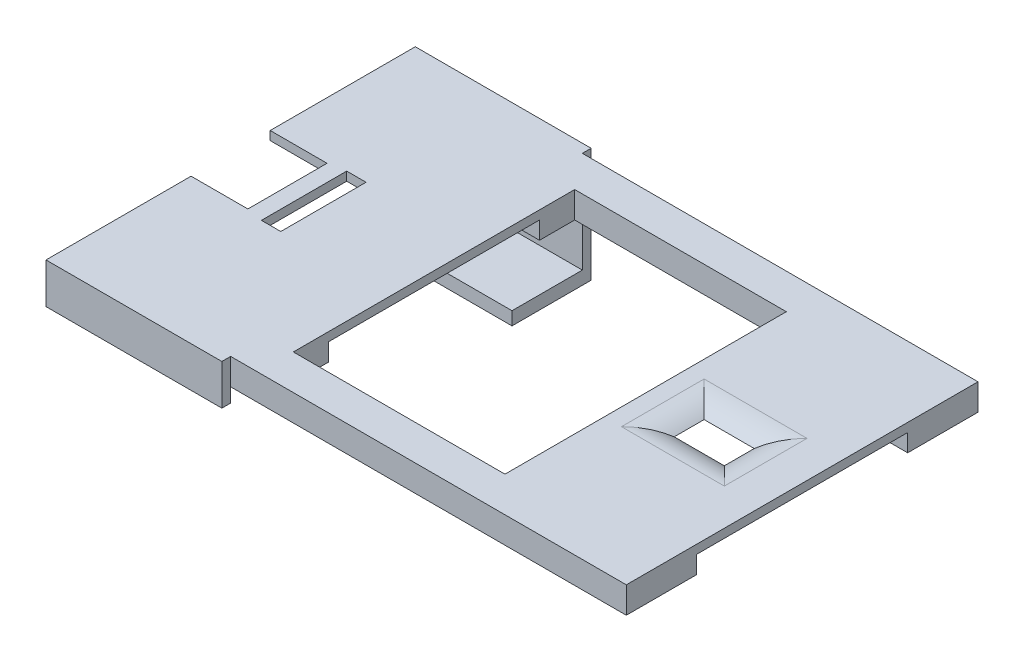
ISO-10303-21;
HEADER;
FILE_DESCRIPTION(('STEP AP214'),'2;1');
FILE_NAME('part.step','',(''),(''),'','','');
FILE_SCHEMA(('AUTOMOTIVE_DESIGN { 1 0 10303 214 1 1 1 1 }'));
ENDSEC;
DATA;
#1=APPLICATION_CONTEXT('core data for automotive mechanical design processes');
#2=APPLICATION_PROTOCOL_DEFINITION('international standard','automotive_design',2000,#1);
#3=PRODUCT_CONTEXT('',#1,'mechanical');
#4=PRODUCT('Part','Part','',(#3));
#5=PRODUCT_RELATED_PRODUCT_CATEGORY('part','',(#4));
#6=PRODUCT_DEFINITION_FORMATION('','',#4);
#7=PRODUCT_DEFINITION_CONTEXT('part definition',#1,'design');
#8=PRODUCT_DEFINITION('design','',#6,#7);
#9=PRODUCT_DEFINITION_SHAPE('','',#8);
#10=(LENGTH_UNIT() NAMED_UNIT(*) SI_UNIT(.MILLI.,.METRE.));
#11=(NAMED_UNIT(*) PLANE_ANGLE_UNIT() SI_UNIT($,.RADIAN.));
#12=(NAMED_UNIT(*) SI_UNIT($,.STERADIAN.) SOLID_ANGLE_UNIT());
#13=UNCERTAINTY_MEASURE_WITH_UNIT(LENGTH_MEASURE(1.E-05),#10,'distance_accuracy_value','');
#14=(GEOMETRIC_REPRESENTATION_CONTEXT(3) GLOBAL_UNCERTAINTY_ASSIGNED_CONTEXT((#13)) GLOBAL_UNIT_ASSIGNED_CONTEXT((#10,
#11,#12)) REPRESENTATION_CONTEXT('',''));
#15=CARTESIAN_POINT('',(0.,0.,0.));
#16=DIRECTION('',(0.,0.,1.));
#17=DIRECTION('',(1.,0.,0.));
#18=AXIS2_PLACEMENT_3D('',#15,#16,#17);
#19=CARTESIAN_POINT('',(0.,0.,0.));
#20=DIRECTION('',(0.,1.,0.));
#21=DIRECTION('',(0.,0.,1.));
#22=AXIS2_PLACEMENT_3D('',#19,#20,#21);
#23=PLANE('',#22);
#24=DIRECTION('',(1.,0.,0.));
#25=VECTOR('',#24,1.);
#26=CARTESIAN_POINT('',(20.,0.,0.));
#27=LINE('',#26,#25);
#28=CARTESIAN_POINT('',(0.,0.,0.));
#29=VERTEX_POINT('',#28);
#30=CARTESIAN_POINT('',(20.,0.,0.));
#31=VERTEX_POINT('',#30);
#32=EDGE_CURVE('E305',#29,#31,#27,.T.);
#33=ORIENTED_EDGE('',*,*,#32,.F.);
#34=DIRECTION('',(0.,0.,-1.));
#35=VECTOR('',#34,1.);
#36=CARTESIAN_POINT('',(0.,0.,0.));
#37=LINE('',#36,#35);
#38=CARTESIAN_POINT('',(0.,0.,-7.99999999999975));
#39=VERTEX_POINT('',#38);
#40=EDGE_CURVE('E492',#29,#39,#37,.T.);
#41=ORIENTED_EDGE('',*,*,#40,.T.);
#42=DIRECTION('',(1.,0.,0.));
#43=VECTOR('',#42,1.);
#44=CARTESIAN_POINT('',(0.,0.,-7.99999999999975));
#45=LINE('',#44,#43);
#46=CARTESIAN_POINT('',(23.13,0.,-7.99999999999975));
#47=VERTEX_POINT('',#46);
#48=EDGE_CURVE('E383',#39,#47,#45,.T.);
#49=ORIENTED_EDGE('',*,*,#48,.T.);
#50=DIRECTION('',(0.,0.,1.));
#51=VECTOR('',#50,1.);
#52=CARTESIAN_POINT('',(23.13,0.,0.));
#53=LINE('',#52,#51);
#54=CARTESIAN_POINT('',(23.13,0.,-4.));
#55=VERTEX_POINT('',#54);
#56=EDGE_CURVE('E485',#47,#55,#53,.T.);
#57=ORIENTED_EDGE('',*,*,#56,.T.);
#58=DIRECTION('',(1.,0.,0.));
#59=VECTOR('',#58,1.);
#60=CARTESIAN_POINT('',(0.,0.,-4.));
#61=LINE('',#60,#59);
#62=CARTESIAN_POINT('',(47.2,0.,-4.));
#63=VERTEX_POINT('',#62);
#64=EDGE_CURVE('E482',#55,#63,#61,.T.);
#65=ORIENTED_EDGE('',*,*,#64,.T.);
#66=DIRECTION('',(0.,0.,-1.));
#67=VECTOR('',#66,1.);
#68=CARTESIAN_POINT('',(47.2,0.,0.));
#69=LINE('',#68,#67);
#70=CARTESIAN_POINT('',(47.2,0.,-7.99999999999975));
#71=VERTEX_POINT('',#70);
#72=EDGE_CURVE('E479',#63,#71,#69,.T.);
#73=ORIENTED_EDGE('',*,*,#72,.T.);
#74=DIRECTION('',(1.,0.,0.));
#75=VECTOR('',#74,1.);
#76=CARTESIAN_POINT('',(0.,0.,-7.99999999999975));
#77=LINE('',#76,#75);
#78=CARTESIAN_POINT('',(65.,0.,-7.99999999999975));
#79=VERTEX_POINT('',#78);
#80=EDGE_CURVE('E545',#71,#79,#77,.T.);
#81=ORIENTED_EDGE('',*,*,#80,.T.);
#82=DIRECTION('',(0.,0.,-1.));
#83=VECTOR('',#82,1.);
#84=CARTESIAN_POINT('',(65.,0.,0.));
#85=LINE('',#84,#83);
#86=CARTESIAN_POINT('',(65.,0.,0.));
#87=VERTEX_POINT('',#86);
#88=EDGE_CURVE('E497',#87,#79,#85,.T.);
#89=ORIENTED_EDGE('',*,*,#88,.F.);
#90=DIRECTION('',(1.,0.,0.));
#91=VECTOR('',#90,1.);
#92=CARTESIAN_POINT('',(0.,0.,0.));
#93=LINE('',#92,#91);
#94=EDGE_CURVE('E494',#31,#87,#93,.T.);
#95=ORIENTED_EDGE('',*,*,#94,.F.);
#96=EDGE_LOOP('',(#33,#41,#49,#57,#65,#73,#81,#89,#95));
#97=FACE_BOUND('',#96,.T.);
#98=ADVANCED_FACE('F37',(#97),#23,.F.);
#99=CARTESIAN_POINT('',(0.,3.,0.));
#100=DIRECTION('',(0.,0.,-1.));
#101=DIRECTION('',(-1.,0.,0.));
#102=AXIS2_PLACEMENT_3D('',#99,#100,#101);
#103=PLANE('',#102);
#104=DIRECTION('',(0.,1.,0.));
#105=VECTOR('',#104,1.);
#106=CARTESIAN_POINT('',(20.,0.,0.));
#107=LINE('',#106,#105);
#108=CARTESIAN_POINT('',(20.,3.,0.));
#109=VERTEX_POINT('',#108);
#110=EDGE_CURVE('E315',#31,#109,#107,.T.);
#111=ORIENTED_EDGE('',*,*,#110,.F.);
#112=ORIENTED_EDGE('',*,*,#94,.T.);
#113=DIRECTION('',(0.,-1.,0.));
#114=VECTOR('',#113,1.);
#115=CARTESIAN_POINT('',(65.,3.,0.));
#116=LINE('',#115,#114);
#117=CARTESIAN_POINT('',(65.,3.,0.));
#118=VERTEX_POINT('',#117);
#119=EDGE_CURVE('E509',#118,#87,#116,.T.);
#120=ORIENTED_EDGE('',*,*,#119,.F.);
#121=DIRECTION('',(1.,0.,0.));
#122=VECTOR('',#121,1.);
#123=CARTESIAN_POINT('',(0.,3.,0.));
#124=LINE('',#123,#122);
#125=EDGE_CURVE('E471',#109,#118,#124,.T.);
#126=ORIENTED_EDGE('',*,*,#125,.F.);
#127=EDGE_LOOP('',(#111,#112,#120,#126));
#128=FACE_BOUND('',#127,.T.);
#129=ADVANCED_FACE('F593',(#128),#103,.F.);
#130=CARTESIAN_POINT('',(0.,-10.,-40.));
#131=DIRECTION('',(0.,0.,-1.));
#132=DIRECTION('',(-1.,0.,0.));
#133=AXIS2_PLACEMENT_3D('',#130,#131,#132);
#134=PLANE('',#133);
#135=DIRECTION('',(-1.,0.,0.));
#136=VECTOR('',#135,1.);
#137=CARTESIAN_POINT('',(0.,-8.5,-40.));
#138=LINE('',#137,#136);
#139=CARTESIAN_POINT('',(20.,-8.5,-40.));
#140=VERTEX_POINT('',#139);
#141=CARTESIAN_POINT('',(0.,-8.5,-40.));
#142=VERTEX_POINT('',#141);
#143=EDGE_CURVE('E320',#140,#142,#138,.T.);
#144=ORIENTED_EDGE('',*,*,#143,.F.);
#145=DIRECTION('',(0.,1.,0.));
#146=VECTOR('',#145,1.);
#147=CARTESIAN_POINT('',(20.,-10.,-40.));
#148=LINE('',#147,#146);
#149=CARTESIAN_POINT('',(20.,0.,-40.));
#150=VERTEX_POINT('',#149);
#151=EDGE_CURVE('E350',#140,#150,#148,.T.);
#152=ORIENTED_EDGE('',*,*,#151,.T.);
#153=DIRECTION('',(-1.,0.,0.));
#154=VECTOR('',#153,1.);
#155=CARTESIAN_POINT('',(0.,0.,-40.));
#156=LINE('',#155,#154);
#157=CARTESIAN_POINT('',(0.,0.,-40.));
#158=VERTEX_POINT('',#157);
#159=EDGE_CURVE('E337',#150,#158,#156,.T.);
#160=ORIENTED_EDGE('',*,*,#159,.T.);
#161=DIRECTION('',(0.,1.,0.));
#162=VECTOR('',#161,1.);
#163=CARTESIAN_POINT('',(0.,-10.,-40.));
#164=LINE('',#163,#162);
#165=EDGE_CURVE('E346',#142,#158,#164,.T.);
#166=ORIENTED_EDGE('',*,*,#165,.F.);
#167=EDGE_LOOP('',(#144,#152,#160,#166));
#168=FACE_BOUND('',#167,.T.);
#169=ADVANCED_FACE('F600',(#168),#134,.F.);
#170=ORIENTED_EDGE('',*,*,#159,.F.);
#171=DIRECTION('',(1.,0.,0.));
#172=VECTOR('',#171,1.);
#173=CARTESIAN_POINT('',(0.,0.,-40.));
#174=LINE('',#173,#172);
#175=CARTESIAN_POINT('',(65.,0.,-40.));
#176=VERTEX_POINT('',#175);
#177=EDGE_CURVE('E500',#150,#176,#174,.T.);
#178=ORIENTED_EDGE('',*,*,#177,.T.);
#179=CARTESIAN_POINT('',(65.,0.,-31.9999999999998));
#180=VERTEX_POINT('',#179);
#181=EDGE_CURVE('E496',#180,#176,#85,.T.);
#182=ORIENTED_EDGE('',*,*,#181,.F.);
#183=DIRECTION('',(-1.,0.,0.));
#184=VECTOR('',#183,1.);
#185=CARTESIAN_POINT('',(0.,0.,-31.9999999999998));
#186=LINE('',#185,#184);
#187=CARTESIAN_POINT('',(47.2,0.,-31.9999999999998));
#188=VERTEX_POINT('',#187);
#189=EDGE_CURVE('E521',#180,#188,#186,.T.);
#190=ORIENTED_EDGE('',*,*,#189,.T.);
#191=CARTESIAN_POINT('',(47.2,0.,-36.));
#192=VERTEX_POINT('',#191);
#193=EDGE_CURVE('E436',#188,#192,#69,.T.);
#194=ORIENTED_EDGE('',*,*,#193,.T.);
#195=DIRECTION('',(1.,0.,0.));
#196=VECTOR('',#195,1.);
#197=CARTESIAN_POINT('',(0.,0.,-36.));
#198=LINE('',#197,#196);
#199=CARTESIAN_POINT('',(23.13,0.,-36.));
#200=VERTEX_POINT('',#199);
#201=EDGE_CURVE('E489',#200,#192,#198,.T.);
#202=ORIENTED_EDGE('',*,*,#201,.F.);
#203=CARTESIAN_POINT('',(23.13,0.,-31.9999999999998));
#204=VERTEX_POINT('',#203);
#205=EDGE_CURVE('E486',#200,#204,#53,.T.);
#206=ORIENTED_EDGE('',*,*,#205,.T.);
#207=DIRECTION('',(1.,0.,0.));
#208=VECTOR('',#207,1.);
#209=CARTESIAN_POINT('',(0.,0.,-31.9999999999998));
#210=LINE('',#209,#208);
#211=CARTESIAN_POINT('',(0.,0.,-31.9999999999998));
#212=VERTEX_POINT('',#211);
#213=EDGE_CURVE('E382',#212,#204,#210,.T.);
#214=ORIENTED_EDGE('',*,*,#213,.F.);
#215=EDGE_CURVE('E441',#212,#158,#37,.T.);
#216=ORIENTED_EDGE('',*,*,#215,.T.);
#217=EDGE_LOOP('',(#170,#178,#182,#190,#194,#202,#206,#214,#216));
#218=FACE_BOUND('',#217,.T.);
#219=ADVANCED_FACE('F596',(#218),#23,.F.);
#220=CARTESIAN_POINT('',(0.,3.,-24.4999999999535));
#221=DIRECTION('',(0.,0.,-1.));
#222=DIRECTION('',(-1.,0.,0.));
#223=AXIS2_PLACEMENT_3D('',#220,#221,#222);
#224=PLANE('',#223);
#225=DIRECTION('',(0.,-1.,0.));
#226=VECTOR('',#225,1.);
#227=CARTESIAN_POINT('',(0.,3.,-24.4999999999535));
#228=LINE('',#227,#226);
#229=CARTESIAN_POINT('',(0.,3.,-24.4999999999535));
#230=VERTEX_POINT('',#229);
#231=CARTESIAN_POINT('',(0.,2.,-24.4999999999535));
#232=VERTEX_POINT('',#231);
#233=EDGE_CURVE('E502',#230,#232,#228,.T.);
#234=ORIENTED_EDGE('',*,*,#233,.T.);
#235=DIRECTION('',(1.,0.,0.));
#236=VECTOR('',#235,1.);
#237=CARTESIAN_POINT('',(0.,2.,-24.4999999999535));
#238=LINE('',#237,#236);
#239=CARTESIAN_POINT('',(6.46,2.,-24.4999999999535));
#240=VERTEX_POINT('',#239);
#241=EDGE_CURVE('E433',#232,#240,#238,.T.);
#242=ORIENTED_EDGE('',*,*,#241,.T.);
#243=DIRECTION('',(0.,-1.,0.));
#244=VECTOR('',#243,1.);
#245=CARTESIAN_POINT('',(6.46,3.,-24.4999999999535));
#246=LINE('',#245,#244);
#247=CARTESIAN_POINT('',(6.46,3.,-24.4999999999535));
#248=VERTEX_POINT('',#247);
#249=EDGE_CURVE('E518',#248,#240,#246,.T.);
#250=ORIENTED_EDGE('',*,*,#249,.F.);
#251=DIRECTION('',(1.,0.,0.));
#252=VECTOR('',#251,1.);
#253=CARTESIAN_POINT('',(0.,3.,-24.4999999999535));
#254=LINE('',#253,#252);
#255=EDGE_CURVE('E460',#230,#248,#254,.T.);
#256=ORIENTED_EDGE('',*,*,#255,.F.);
#257=EDGE_LOOP('',(#234,#242,#250,#256));
#258=FACE_BOUND('',#257,.T.);
#259=ADVANCED_FACE('F607',(#258),#224,.F.);
#260=CARTESIAN_POINT('',(6.46,3.,0.));
#261=DIRECTION('',(1.,0.,0.));
#262=DIRECTION('',(0.,0.,-1.));
#263=AXIS2_PLACEMENT_3D('',#260,#261,#262);
#264=PLANE('',#263);
#265=ORIENTED_EDGE('',*,*,#249,.T.);
#266=DIRECTION('',(0.,0.,1.));
#267=VECTOR('',#266,1.);
#268=CARTESIAN_POINT('',(6.46,2.,0.));
#269=LINE('',#268,#267);
#270=CARTESIAN_POINT('',(6.46,2.,-15.4999999999535));
#271=VERTEX_POINT('',#270);
#272=EDGE_CURVE('E430',#240,#271,#269,.T.);
#273=ORIENTED_EDGE('',*,*,#272,.T.);
#274=DIRECTION('',(0.,-1.,0.));
#275=VECTOR('',#274,1.);
#276=CARTESIAN_POINT('',(6.46,3.,-15.4999999999535));
#277=LINE('',#276,#275);
#278=CARTESIAN_POINT('',(6.46,3.,-15.4999999999535));
#279=VERTEX_POINT('',#278);
#280=EDGE_CURVE('E515',#279,#271,#277,.T.);
#281=ORIENTED_EDGE('',*,*,#280,.F.);
#282=DIRECTION('',(0.,0.,1.));
#283=VECTOR('',#282,1.);
#284=CARTESIAN_POINT('',(6.46,3.,0.));
#285=LINE('',#284,#283);
#286=EDGE_CURVE('E463',#248,#279,#285,.T.);
#287=ORIENTED_EDGE('',*,*,#286,.F.);
#288=EDGE_LOOP('',(#265,#273,#281,#287));
#289=FACE_BOUND('',#288,.T.);
#290=ADVANCED_FACE('F613',(#289),#264,.F.);
#291=CARTESIAN_POINT('',(0.,3.,-15.4999999999535));
#292=DIRECTION('',(0.,0.,-1.));
#293=DIRECTION('',(-1.,0.,0.));
#294=AXIS2_PLACEMENT_3D('',#291,#292,#293);
#295=PLANE('',#294);
#296=DIRECTION('',(1.,0.,0.));
#297=VECTOR('',#296,1.);
#298=CARTESIAN_POINT('',(0.,2.,-15.4999999999535));
#299=LINE('',#298,#297);
#300=CARTESIAN_POINT('',(0.,2.,-15.4999999999535));
#301=VERTEX_POINT('',#300);
#302=EDGE_CURVE('E428',#301,#271,#299,.T.);
#303=ORIENTED_EDGE('',*,*,#302,.F.);
#304=DIRECTION('',(0.,-1.,0.));
#305=VECTOR('',#304,1.);
#306=CARTESIAN_POINT('',(0.,3.,-15.4999999999535));
#307=LINE('',#306,#305);
#308=CARTESIAN_POINT('',(0.,3.,-15.4999999999535));
#309=VERTEX_POINT('',#308);
#310=EDGE_CURVE('E512',#309,#301,#307,.T.);
#311=ORIENTED_EDGE('',*,*,#310,.F.);
#312=DIRECTION('',(1.,0.,0.));
#313=VECTOR('',#312,1.);
#314=CARTESIAN_POINT('',(0.,3.,-15.4999999999535));
#315=LINE('',#314,#313);
#316=EDGE_CURVE('E465',#309,#279,#315,.T.);
#317=ORIENTED_EDGE('',*,*,#316,.T.);
#318=ORIENTED_EDGE('',*,*,#280,.T.);
#319=EDGE_LOOP('',(#303,#311,#317,#318));
#320=FACE_BOUND('',#319,.T.);
#321=ADVANCED_FACE('F690',(#320),#295,.T.);
#322=CARTESIAN_POINT('',(0.,3.,0.));
#323=DIRECTION('',(-1.,0.,0.));
#324=DIRECTION('',(0.,0.,1.));
#325=AXIS2_PLACEMENT_3D('',#322,#323,#324);
#326=PLANE('',#325);
#327=DIRECTION('',(0.,-1.,0.));
#328=VECTOR('',#327,1.);
#329=CARTESIAN_POINT('',(0.,0.,-7.99999999999975));
#330=LINE('',#329,#328);
#331=CARTESIAN_POINT('',(0.,2.,-7.99999999999975));
#332=VERTEX_POINT('',#331);
#333=EDGE_CURVE('E379',#332,#39,#330,.T.);
#334=ORIENTED_EDGE('',*,*,#333,.T.);
#335=ORIENTED_EDGE('',*,*,#40,.F.);
#336=DIRECTION('',(0.,1.,0.));
#337=VECTOR('',#336,1.);
#338=CARTESIAN_POINT('',(0.,-1.6,0.));
#339=LINE('',#338,#337);
#340=CARTESIAN_POINT('',(0.,-1.6,0.));
#341=VERTEX_POINT('',#340);
#342=EDGE_CURVE('E313',#341,#29,#339,.T.);
#343=ORIENTED_EDGE('',*,*,#342,.F.);
#344=DIRECTION('',(0.,0.,-1.));
#345=VECTOR('',#344,1.);
#346=CARTESIAN_POINT('',(0.,-1.6,1.));
#347=LINE('',#346,#345);
#348=CARTESIAN_POINT('',(0.,-1.6,1.));
#349=VERTEX_POINT('',#348);
#350=EDGE_CURVE('E299',#349,#341,#347,.T.);
#351=ORIENTED_EDGE('',*,*,#350,.F.);
#352=DIRECTION('',(0.,-1.,0.));
#353=VECTOR('',#352,1.);
#354=CARTESIAN_POINT('',(0.,0.,1.));
#355=LINE('',#354,#353);
#356=CARTESIAN_POINT('',(0.,3.,1.));
#357=VERTEX_POINT('',#356);
#358=EDGE_CURVE('E291',#357,#349,#355,.T.);
#359=ORIENTED_EDGE('',*,*,#358,.F.);
#360=DIRECTION('',(0.,0.,-1.));
#361=VECTOR('',#360,1.);
#362=CARTESIAN_POINT('',(0.,3.,0.));
#363=LINE('',#362,#361);
#364=EDGE_CURVE('E468',#357,#309,#363,.T.);
#365=ORIENTED_EDGE('',*,*,#364,.T.);
#366=ORIENTED_EDGE('',*,*,#310,.T.);
#367=DIRECTION('',(0.,0.,1.));
#368=VECTOR('',#367,1.);
#369=CARTESIAN_POINT('',(0.,2.,-7.99999999999975));
#370=LINE('',#369,#368);
#371=EDGE_CURVE('E375',#301,#332,#370,.T.);
#372=ORIENTED_EDGE('',*,*,#371,.T.);
#373=EDGE_LOOP('',(#334,#335,#343,#351,#359,#365,#366,#372));
#374=FACE_BOUND('',#373,.T.);
#375=ADVANCED_FACE('F692',(#374),#326,.T.);
#376=CARTESIAN_POINT('',(65.,3.,0.));
#377=DIRECTION('',(-1.,0.,0.));
#378=DIRECTION('',(0.,0.,1.));
#379=AXIS2_PLACEMENT_3D('',#376,#377,#378);
#380=PLANE('',#379);
#381=ORIENTED_EDGE('',*,*,#88,.T.);
#382=DIRECTION('',(0.,-1.,0.));
#383=VECTOR('',#382,1.);
#384=CARTESIAN_POINT('',(65.,0.,-7.99999999999975));
#385=LINE('',#384,#383);
#386=CARTESIAN_POINT('',(65.,2.,-7.99999999999975));
#387=VERTEX_POINT('',#386);
#388=EDGE_CURVE('E370',#387,#79,#385,.T.);
#389=ORIENTED_EDGE('',*,*,#388,.F.);
#390=DIRECTION('',(0.,0.,1.));
#391=VECTOR('',#390,1.);
#392=CARTESIAN_POINT('',(65.,2.,-7.99999999999975));
#393=LINE('',#392,#391);
#394=CARTESIAN_POINT('',(65.,2.,-31.9999999999998));
#395=VERTEX_POINT('',#394);
#396=EDGE_CURVE('E367',#395,#387,#393,.T.);
#397=ORIENTED_EDGE('',*,*,#396,.F.);
#398=DIRECTION('',(0.,1.,0.));
#399=VECTOR('',#398,1.);
#400=CARTESIAN_POINT('',(65.,2.,-31.9999999999998));
#401=LINE('',#400,#399);
#402=EDGE_CURVE('E364',#180,#395,#401,.T.);
#403=ORIENTED_EDGE('',*,*,#402,.F.);
#404=ORIENTED_EDGE('',*,*,#181,.T.);
#405=DIRECTION('',(0.,-1.,0.));
#406=VECTOR('',#405,1.);
#407=CARTESIAN_POINT('',(65.,3.,-40.));
#408=LINE('',#407,#406);
#409=CARTESIAN_POINT('',(65.,3.,-40.));
#410=VERTEX_POINT('',#409);
#411=EDGE_CURVE('E505',#410,#176,#408,.T.);
#412=ORIENTED_EDGE('',*,*,#411,.F.);
#413=DIRECTION('',(0.,0.,-1.));
#414=VECTOR('',#413,1.);
#415=CARTESIAN_POINT('',(65.,3.,0.));
#416=LINE('',#415,#414);
#417=EDGE_CURVE('E474',#118,#410,#416,.T.);
#418=ORIENTED_EDGE('',*,*,#417,.F.);
#419=ORIENTED_EDGE('',*,*,#119,.T.);
#420=EDGE_LOOP('',(#381,#389,#397,#403,#404,#412,#418,#419));
#421=FACE_BOUND('',#420,.T.);
#422=ADVANCED_FACE('F640',(#421),#380,.F.);
#423=CARTESIAN_POINT('',(0.,3.,-40.));
#424=DIRECTION('',(0.,0.,-1.));
#425=DIRECTION('',(-1.,0.,0.));
#426=AXIS2_PLACEMENT_3D('',#423,#424,#425);
#427=PLANE('',#426);
#428=DIRECTION('',(0.,-1.,0.));
#429=VECTOR('',#428,1.);
#430=CARTESIAN_POINT('',(20.,0.,-40.));
#431=LINE('',#430,#429);
#432=CARTESIAN_POINT('',(20.,3.,-40.));
#433=VERTEX_POINT('',#432);
#434=EDGE_CURVE('E54',#433,#150,#431,.T.);
#435=ORIENTED_EDGE('',*,*,#434,.F.);
#436=DIRECTION('',(1.,0.,0.));
#437=VECTOR('',#436,1.);
#438=CARTESIAN_POINT('',(0.,3.,-40.));
#439=LINE('',#438,#437);
#440=EDGE_CURVE('E477',#433,#410,#439,.T.);
#441=ORIENTED_EDGE('',*,*,#440,.T.);
#442=ORIENTED_EDGE('',*,*,#411,.T.);
#443=ORIENTED_EDGE('',*,*,#177,.F.);
#444=EDGE_LOOP('',(#435,#441,#442,#443));
#445=FACE_BOUND('',#444,.T.);
#446=ADVANCED_FACE('F625',(#445),#427,.T.);
#447=CARTESIAN_POINT('',(10.55,3.,0.));
#448=DIRECTION('',(-1.,0.,0.));
#449=DIRECTION('',(0.,0.,1.));
#450=AXIS2_PLACEMENT_3D('',#447,#448,#449);
#451=PLANE('',#450);
#452=DIRECTION('',(0.,0.,-1.));
#453=VECTOR('',#452,1.);
#454=CARTESIAN_POINT('',(10.55,2.,0.));
#455=LINE('',#454,#453);
#456=CARTESIAN_POINT('',(10.55,2.,-15.1499999999535));
#457=VERTEX_POINT('',#456);
#458=CARTESIAN_POINT('',(10.55,2.,-24.8499999999535));
#459=VERTEX_POINT('',#458);
#460=EDGE_CURVE('E411',#457,#459,#455,.T.);
#461=ORIENTED_EDGE('',*,*,#460,.F.);
#462=DIRECTION('',(0.,-1.,0.));
#463=VECTOR('',#462,1.);
#464=CARTESIAN_POINT('',(10.55,3.,-15.1499999999535));
#465=LINE('',#464,#463);
#466=CARTESIAN_POINT('',(10.55,3.,-15.1499999999535));
#467=VERTEX_POINT('',#466);
#468=EDGE_CURVE('E506',#467,#457,#465,.T.);
#469=ORIENTED_EDGE('',*,*,#468,.F.);
#470=DIRECTION('',(0.,0.,-1.));
#471=VECTOR('',#470,1.);
#472=CARTESIAN_POINT('',(10.55,3.,0.));
#473=LINE('',#472,#471);
#474=CARTESIAN_POINT('',(10.55,3.,-24.8499999999535));
#475=VERTEX_POINT('',#474);
#476=EDGE_CURVE('E449',#467,#475,#473,.T.);
#477=ORIENTED_EDGE('',*,*,#476,.T.);
#478=DIRECTION('',(0.,-1.,0.));
#479=VECTOR('',#478,1.);
#480=CARTESIAN_POINT('',(10.55,3.,-24.8499999999535));
#481=LINE('',#480,#479);
#482=EDGE_CURVE('E522',#475,#459,#481,.T.);
#483=ORIENTED_EDGE('',*,*,#482,.T.);
#484=EDGE_LOOP('',(#461,#469,#477,#483));
#485=FACE_BOUND('',#484,.T.);
#486=ADVANCED_FACE('F745',(#485),#451,.T.);
#487=CARTESIAN_POINT('',(0.,3.,-15.1499999999535));
#488=DIRECTION('',(0.,0.,-1.));
#489=DIRECTION('',(-1.,0.,0.));
#490=AXIS2_PLACEMENT_3D('',#487,#488,#489);
#491=PLANE('',#490);
#492=DIRECTION('',(1.,0.,0.));
#493=VECTOR('',#492,1.);
#494=CARTESIAN_POINT('',(0.,2.,-15.1499999999535));
#495=LINE('',#494,#493);
#496=CARTESIAN_POINT('',(8.35,2.,-15.1499999999535));
#497=VERTEX_POINT('',#496);
#498=EDGE_CURVE('E409',#497,#457,#495,.T.);
#499=ORIENTED_EDGE('',*,*,#498,.F.);
#500=DIRECTION('',(0.,-1.,0.));
#501=VECTOR('',#500,1.);
#502=CARTESIAN_POINT('',(8.35,3.,-15.1499999999535));
#503=LINE('',#502,#501);
#504=CARTESIAN_POINT('',(8.35,3.,-15.1499999999535));
#505=VERTEX_POINT('',#504);
#506=EDGE_CURVE('E529',#505,#497,#503,.T.);
#507=ORIENTED_EDGE('',*,*,#506,.F.);
#508=DIRECTION('',(1.,0.,0.));
#509=VECTOR('',#508,1.);
#510=CARTESIAN_POINT('',(0.,3.,-15.1499999999535));
#511=LINE('',#510,#509);
#512=EDGE_CURVE('E452',#505,#467,#511,.T.);
#513=ORIENTED_EDGE('',*,*,#512,.T.);
#514=ORIENTED_EDGE('',*,*,#468,.T.);
#515=EDGE_LOOP('',(#499,#507,#513,#514));
#516=FACE_BOUND('',#515,.T.);
#517=ADVANCED_FACE('F741',(#516),#491,.T.);
#518=CARTESIAN_POINT('',(8.35,3.,0.));
#519=DIRECTION('',(-1.,0.,0.));
#520=DIRECTION('',(0.,0.,1.));
#521=AXIS2_PLACEMENT_3D('',#518,#519,#520);
#522=PLANE('',#521);
#523=ORIENTED_EDGE('',*,*,#506,.T.);
#524=DIRECTION('',(0.,0.,-1.));
#525=VECTOR('',#524,1.);
#526=CARTESIAN_POINT('',(8.35,2.,0.));
#527=LINE('',#526,#525);
#528=CARTESIAN_POINT('',(8.35,2.,-24.8499999999535));
#529=VERTEX_POINT('',#528);
#530=EDGE_CURVE('E406',#497,#529,#527,.T.);
#531=ORIENTED_EDGE('',*,*,#530,.T.);
#532=DIRECTION('',(0.,-1.,0.));
#533=VECTOR('',#532,1.);
#534=CARTESIAN_POINT('',(8.35,3.,-24.8499999999535));
#535=LINE('',#534,#533);
#536=CARTESIAN_POINT('',(8.35,3.,-24.8499999999535));
#537=VERTEX_POINT('',#536);
#538=EDGE_CURVE('E525',#537,#529,#535,.T.);
#539=ORIENTED_EDGE('',*,*,#538,.F.);
#540=DIRECTION('',(0.,0.,-1.));
#541=VECTOR('',#540,1.);
#542=CARTESIAN_POINT('',(8.35,3.,0.));
#543=LINE('',#542,#541);
#544=EDGE_CURVE('E455',#505,#537,#543,.T.);
#545=ORIENTED_EDGE('',*,*,#544,.F.);
#546=EDGE_LOOP('',(#523,#531,#539,#545));
#547=FACE_BOUND('',#546,.T.);
#548=ADVANCED_FACE('F738',(#547),#522,.F.);
#549=CARTESIAN_POINT('',(47.2,3.,0.));
#550=DIRECTION('',(-1.,0.,0.));
#551=DIRECTION('',(0.,0.,1.));
#552=AXIS2_PLACEMENT_3D('',#549,#550,#551);
#553=PLANE('',#552);
#554=DIRECTION('',(0.,1.,0.));
#555=VECTOR('',#554,1.);
#556=CARTESIAN_POINT('',(47.2,3.,-7.99999999999975));
#557=LINE('',#556,#555);
#558=CARTESIAN_POINT('',(47.2,2.,-7.99999999999975));
#559=VERTEX_POINT('',#558);
#560=EDGE_CURVE('E401',#71,#559,#557,.T.);
#561=ORIENTED_EDGE('',*,*,#560,.F.);
#562=ORIENTED_EDGE('',*,*,#72,.F.);
#563=DIRECTION('',(0.,-1.,0.));
#564=VECTOR('',#563,1.);
#565=CARTESIAN_POINT('',(47.2,3.,-4.));
#566=LINE('',#565,#564);
#567=CARTESIAN_POINT('',(47.2,3.,-4.));
#568=VERTEX_POINT('',#567);
#569=EDGE_CURVE('E526',#568,#63,#566,.T.);
#570=ORIENTED_EDGE('',*,*,#569,.F.);
#571=DIRECTION('',(0.,0.,-1.));
#572=VECTOR('',#571,1.);
#573=CARTESIAN_POINT('',(47.2,3.,0.));
#574=LINE('',#573,#572);
#575=CARTESIAN_POINT('',(47.2,3.,-36.));
#576=VERTEX_POINT('',#575);
#577=EDGE_CURVE('E437',#568,#576,#574,.T.);
#578=ORIENTED_EDGE('',*,*,#577,.T.);
#579=DIRECTION('',(0.,-1.,0.));
#580=VECTOR('',#579,1.);
#581=CARTESIAN_POINT('',(47.2,3.,-36.));
#582=LINE('',#581,#580);
#583=EDGE_CURVE('E534',#576,#192,#582,.T.);
#584=ORIENTED_EDGE('',*,*,#583,.T.);
#585=ORIENTED_EDGE('',*,*,#193,.F.);
#586=DIRECTION('',(0.,-1.,0.));
#587=VECTOR('',#586,1.);
#588=CARTESIAN_POINT('',(47.2,3.,-31.9999999999998));
#589=LINE('',#588,#587);
#590=CARTESIAN_POINT('',(47.2,2.,-31.9999999999998));
#591=VERTEX_POINT('',#590);
#592=EDGE_CURVE('E397',#591,#188,#589,.T.);
#593=ORIENTED_EDGE('',*,*,#592,.F.);
#594=DIRECTION('',(0.,0.,-1.));
#595=VECTOR('',#594,1.);
#596=CARTESIAN_POINT('',(47.2,2.,0.));
#597=LINE('',#596,#595);
#598=EDGE_CURVE('E426',#559,#591,#597,.T.);
#599=ORIENTED_EDGE('',*,*,#598,.F.);
#600=EDGE_LOOP('',(#561,#562,#570,#578,#584,#585,#593,#599));
#601=FACE_BOUND('',#600,.T.);
#602=ADVANCED_FACE('F649',(#601),#553,.T.);
#603=CARTESIAN_POINT('',(0.,3.,-4.));
#604=DIRECTION('',(0.,0.,-1.));
#605=DIRECTION('',(-1.,0.,0.));
#606=AXIS2_PLACEMENT_3D('',#603,#604,#605);
#607=PLANE('',#606);
#608=ORIENTED_EDGE('',*,*,#64,.F.);
#609=DIRECTION('',(0.,-1.,0.));
#610=VECTOR('',#609,1.);
#611=CARTESIAN_POINT('',(23.13,3.,-4.));
#612=LINE('',#611,#610);
#613=CARTESIAN_POINT('',(23.13,3.,-4.));
#614=VERTEX_POINT('',#613);
#615=EDGE_CURVE('E539',#614,#55,#612,.T.);
#616=ORIENTED_EDGE('',*,*,#615,.F.);
#617=DIRECTION('',(1.,0.,0.));
#618=VECTOR('',#617,1.);
#619=CARTESIAN_POINT('',(0.,3.,-4.));
#620=LINE('',#619,#618);
#621=EDGE_CURVE('E440',#614,#568,#620,.T.);
#622=ORIENTED_EDGE('',*,*,#621,.T.);
#623=ORIENTED_EDGE('',*,*,#569,.T.);
#624=EDGE_LOOP('',(#608,#616,#622,#623));
#625=FACE_BOUND('',#624,.T.);
#626=ADVANCED_FACE('F752',(#625),#607,.T.);
#627=CARTESIAN_POINT('',(23.13,3.,0.));
#628=DIRECTION('',(1.,0.,0.));
#629=DIRECTION('',(0.,0.,-1.));
#630=AXIS2_PLACEMENT_3D('',#627,#628,#629);
#631=PLANE('',#630);
#632=DIRECTION('',(0.,-1.,0.));
#633=VECTOR('',#632,1.);
#634=CARTESIAN_POINT('',(23.13,3.,-7.99999999999975));
#635=LINE('',#634,#633);
#636=CARTESIAN_POINT('',(23.13,2.,-7.99999999999975));
#637=VERTEX_POINT('',#636);
#638=EDGE_CURVE('E399',#637,#47,#635,.T.);
#639=ORIENTED_EDGE('',*,*,#638,.F.);
#640=DIRECTION('',(0.,0.,1.));
#641=VECTOR('',#640,1.);
#642=CARTESIAN_POINT('',(23.13,2.,0.));
#643=LINE('',#642,#641);
#644=CARTESIAN_POINT('',(23.13,2.,-31.9999999999998));
#645=VERTEX_POINT('',#644);
#646=EDGE_CURVE('E424',#645,#637,#643,.T.);
#647=ORIENTED_EDGE('',*,*,#646,.F.);
#648=DIRECTION('',(0.,1.,0.));
#649=VECTOR('',#648,1.);
#650=CARTESIAN_POINT('',(23.13,3.,-31.9999999999998));
#651=LINE('',#650,#649);
#652=EDGE_CURVE('E386',#204,#645,#651,.T.);
#653=ORIENTED_EDGE('',*,*,#652,.F.);
#654=ORIENTED_EDGE('',*,*,#205,.F.);
#655=DIRECTION('',(0.,-1.,0.));
#656=VECTOR('',#655,1.);
#657=CARTESIAN_POINT('',(23.13,3.,-36.));
#658=LINE('',#657,#656);
#659=CARTESIAN_POINT('',(23.13,3.,-36.));
#660=VERTEX_POINT('',#659);
#661=EDGE_CURVE('E537',#660,#200,#658,.T.);
#662=ORIENTED_EDGE('',*,*,#661,.F.);
#663=DIRECTION('',(0.,0.,1.));
#664=VECTOR('',#663,1.);
#665=CARTESIAN_POINT('',(23.13,3.,0.));
#666=LINE('',#665,#664);
#667=EDGE_CURVE('E444',#660,#614,#666,.T.);
#668=ORIENTED_EDGE('',*,*,#667,.T.);
#669=ORIENTED_EDGE('',*,*,#615,.T.);
#670=ORIENTED_EDGE('',*,*,#56,.F.);
#671=EDGE_LOOP('',(#639,#647,#653,#654,#662,#668,#669,#670));
#672=FACE_BOUND('',#671,.T.);
#673=ADVANCED_FACE('F660',(#672),#631,.T.);
#674=CARTESIAN_POINT('',(0.,3.,-24.8499999999535));
#675=DIRECTION('',(0.,0.,-1.));
#676=DIRECTION('',(-1.,0.,0.));
#677=AXIS2_PLACEMENT_3D('',#674,#675,#676);
#678=PLANE('',#677);
#679=ORIENTED_EDGE('',*,*,#538,.T.);
#680=DIRECTION('',(1.,0.,0.));
#681=VECTOR('',#680,1.);
#682=CARTESIAN_POINT('',(0.,2.,-24.8499999999535));
#683=LINE('',#682,#681);
#684=EDGE_CURVE('E403',#529,#459,#683,.T.);
#685=ORIENTED_EDGE('',*,*,#684,.T.);
#686=ORIENTED_EDGE('',*,*,#482,.F.);
#687=DIRECTION('',(1.,0.,0.));
#688=VECTOR('',#687,1.);
#689=CARTESIAN_POINT('',(0.,3.,-24.8499999999535));
#690=LINE('',#689,#688);
#691=EDGE_CURVE('E458',#537,#475,#690,.T.);
#692=ORIENTED_EDGE('',*,*,#691,.F.);
#693=EDGE_LOOP('',(#679,#685,#686,#692));
#694=FACE_BOUND('',#693,.T.);
#695=ADVANCED_FACE('F720',(#694),#678,.F.);
#696=CARTESIAN_POINT('',(0.,3.,-36.));
#697=DIRECTION('',(0.,0.,-1.));
#698=DIRECTION('',(-1.,0.,0.));
#699=AXIS2_PLACEMENT_3D('',#696,#697,#698);
#700=PLANE('',#699);
#701=ORIENTED_EDGE('',*,*,#201,.T.);
#702=ORIENTED_EDGE('',*,*,#583,.F.);
#703=DIRECTION('',(1.,0.,0.));
#704=VECTOR('',#703,1.);
#705=CARTESIAN_POINT('',(0.,3.,-36.));
#706=LINE('',#705,#704);
#707=EDGE_CURVE('E447',#660,#576,#706,.T.);
#708=ORIENTED_EDGE('',*,*,#707,.F.);
#709=ORIENTED_EDGE('',*,*,#661,.T.);
#710=EDGE_LOOP('',(#701,#702,#708,#709));
#711=FACE_BOUND('',#710,.T.);
#712=ADVANCED_FACE('F655',(#711),#700,.F.);
#713=CARTESIAN_POINT('',(0.,2.,-31.9999999999998));
#714=VERTEX_POINT('',#713);
#715=EDGE_CURVE('E376',#714,#232,#370,.T.);
#716=ORIENTED_EDGE('',*,*,#715,.T.);
#717=ORIENTED_EDGE('',*,*,#233,.F.);
#718=CARTESIAN_POINT('',(0.,3.,-41.));
#719=VERTEX_POINT('',#718);
#720=EDGE_CURVE('E472',#230,#719,#363,.T.);
#721=ORIENTED_EDGE('',*,*,#720,.T.);
#722=DIRECTION('',(0.,1.,0.));
#723=VECTOR('',#722,1.);
#724=CARTESIAN_POINT('',(0.,0.,-41.));
#725=LINE('',#724,#723);
#726=CARTESIAN_POINT('',(0.,-10.,-41.));
#727=VERTEX_POINT('',#726);
#728=EDGE_CURVE('E352',#727,#719,#725,.T.);
#729=ORIENTED_EDGE('',*,*,#728,.F.);
#730=DIRECTION('',(0.,0.,-1.));
#731=VECTOR('',#730,1.);
#732=CARTESIAN_POINT('',(0.,-10.,-41.));
#733=LINE('',#732,#731);
#734=CARTESIAN_POINT('',(0.,-10.,-32.));
#735=VERTEX_POINT('',#734);
#736=EDGE_CURVE('E338',#735,#727,#733,.T.);
#737=ORIENTED_EDGE('',*,*,#736,.F.);
#738=DIRECTION('',(0.,-1.,0.));
#739=VECTOR('',#738,1.);
#740=CARTESIAN_POINT('',(0.,-10.,-32.));
#741=LINE('',#740,#739);
#742=CARTESIAN_POINT('',(0.,-8.5,-32.));
#743=VERTEX_POINT('',#742);
#744=EDGE_CURVE('E321',#743,#735,#741,.T.);
#745=ORIENTED_EDGE('',*,*,#744,.F.);
#746=DIRECTION('',(0.,0.,-1.));
#747=VECTOR('',#746,1.);
#748=CARTESIAN_POINT('',(0.,-8.5,-32.));
#749=LINE('',#748,#747);
#750=EDGE_CURVE('E331',#743,#142,#749,.T.);
#751=ORIENTED_EDGE('',*,*,#750,.T.);
#752=ORIENTED_EDGE('',*,*,#165,.T.);
#753=ORIENTED_EDGE('',*,*,#215,.F.);
#754=DIRECTION('',(0.,1.,0.));
#755=VECTOR('',#754,1.);
#756=CARTESIAN_POINT('',(0.,2.,-31.9999999999998));
#757=LINE('',#756,#755);
#758=EDGE_CURVE('E372',#212,#714,#757,.T.);
#759=ORIENTED_EDGE('',*,*,#758,.T.);
#760=EDGE_LOOP('',(#716,#717,#721,#729,#737,#745,#751,#752,#753,#759));
#761=FACE_BOUND('',#760,.T.);
#762=ADVANCED_FACE('F667',(#761),#326,.T.);
#763=CARTESIAN_POINT('',(0.,3.,0.));
#764=DIRECTION('',(0.,1.,0.));
#765=DIRECTION('',(0.,0.,1.));
#766=AXIS2_PLACEMENT_3D('',#763,#764,#765);
#767=PLANE('',#766);
#768=DIRECTION('',(0.,0.,1.));
#769=VECTOR('',#768,1.);
#770=CARTESIAN_POINT('',(60.85,3.,-18.2999999999535));
#771=LINE('',#770,#769);
#772=CARTESIAN_POINT('',(60.85,3.,-24.6999999999535));
#773=VERTEX_POINT('',#772);
#774=CARTESIAN_POINT('',(60.85,3.,-15.2999999999535));
#775=VERTEX_POINT('',#774);
#776=EDGE_CURVE('E46',#773,#775,#771,.T.);
#777=ORIENTED_EDGE('',*,*,#776,.T.);
#778=DIRECTION('',(-1.,0.,0.));
#779=VECTOR('',#778,1.);
#780=CARTESIAN_POINT('',(52.15,3.,-15.2999999999535));
#781=LINE('',#780,#779);
#782=CARTESIAN_POINT('',(49.15,3.,-15.2999999999535));
#783=VERTEX_POINT('',#782);
#784=EDGE_CURVE('E11',#775,#783,#781,.T.);
#785=ORIENTED_EDGE('',*,*,#784,.T.);
#786=DIRECTION('',(0.,0.,1.));
#787=VECTOR('',#786,1.);
#788=CARTESIAN_POINT('',(49.15,3.,-21.6999999999535));
#789=LINE('',#788,#787);
#790=CARTESIAN_POINT('',(49.15,3.,-24.6999999999535));
#791=VERTEX_POINT('',#790);
#792=EDGE_CURVE('E550',#783,#791,#789,.F.);
#793=ORIENTED_EDGE('',*,*,#792,.T.);
#794=DIRECTION('',(-1.,0.,0.));
#795=VECTOR('',#794,1.);
#796=CARTESIAN_POINT('',(57.85,3.,-24.6999999999535));
#797=LINE('',#796,#795);
#798=EDGE_CURVE('E548',#791,#773,#797,.F.);
#799=ORIENTED_EDGE('',*,*,#798,.T.);
#800=EDGE_LOOP('',(#777,#785,#793,#799));
#801=FACE_BOUND('',#800,.T.);
#802=ORIENTED_EDGE('',*,*,#577,.F.);
#803=ORIENTED_EDGE('',*,*,#621,.F.);
#804=ORIENTED_EDGE('',*,*,#667,.F.);
#805=ORIENTED_EDGE('',*,*,#707,.T.);
#806=EDGE_LOOP('',(#802,#803,#804,#805));
#807=FACE_BOUND('',#806,.T.);
#808=ORIENTED_EDGE('',*,*,#476,.F.);
#809=ORIENTED_EDGE('',*,*,#512,.F.);
#810=ORIENTED_EDGE('',*,*,#544,.T.);
#811=ORIENTED_EDGE('',*,*,#691,.T.);
#812=EDGE_LOOP('',(#808,#809,#810,#811));
#813=FACE_BOUND('',#812,.T.);
#814=ORIENTED_EDGE('',*,*,#255,.T.);
#815=ORIENTED_EDGE('',*,*,#286,.T.);
#816=ORIENTED_EDGE('',*,*,#316,.F.);
#817=ORIENTED_EDGE('',*,*,#364,.F.);
#818=DIRECTION('',(-1.,0.,0.));
#819=VECTOR('',#818,1.);
#820=CARTESIAN_POINT('',(0.,3.,1.));
#821=LINE('',#820,#819);
#822=CARTESIAN_POINT('',(20.,3.,1.));
#823=VERTEX_POINT('',#822);
#824=EDGE_CURVE('E290',#823,#357,#821,.T.);
#825=ORIENTED_EDGE('',*,*,#824,.F.);
#826=DIRECTION('',(0.,0.,-1.));
#827=VECTOR('',#826,1.);
#828=CARTESIAN_POINT('',(20.,3.,1.));
#829=LINE('',#828,#827);
#830=EDGE_CURVE('E286',#823,#109,#829,.T.);
#831=ORIENTED_EDGE('',*,*,#830,.T.);
#832=ORIENTED_EDGE('',*,*,#125,.T.);
#833=ORIENTED_EDGE('',*,*,#417,.T.);
#834=ORIENTED_EDGE('',*,*,#440,.F.);
#835=DIRECTION('',(0.,0.,1.));
#836=VECTOR('',#835,1.);
#837=CARTESIAN_POINT('',(20.,3.,-41.));
#838=LINE('',#837,#836);
#839=CARTESIAN_POINT('',(20.,3.,-41.));
#840=VERTEX_POINT('',#839);
#841=EDGE_CURVE('E359',#840,#433,#838,.T.);
#842=ORIENTED_EDGE('',*,*,#841,.F.);
#843=DIRECTION('',(1.,0.,0.));
#844=VECTOR('',#843,1.);
#845=CARTESIAN_POINT('',(0.,3.,-41.));
#846=LINE('',#845,#844);
#847=EDGE_CURVE('E355',#719,#840,#846,.T.);
#848=ORIENTED_EDGE('',*,*,#847,.F.);
#849=ORIENTED_EDGE('',*,*,#720,.F.);
#850=EDGE_LOOP('',(#814,#815,#816,#817,#825,#831,#832,#833,#834,#842,#848,#849));
#851=FACE_BOUND('',#850,.T.);
#852=ADVANCED_FACE('F568',(#801,#807,#813,#851),#767,.T.);
#853=CARTESIAN_POINT('',(0.,2.,-31.9999999999998));
#854=DIRECTION('',(0.,0.,-1.));
#855=DIRECTION('',(-1.,0.,0.));
#856=AXIS2_PLACEMENT_3D('',#853,#854,#855);
#857=PLANE('',#856);
#858=ORIENTED_EDGE('',*,*,#652,.T.);
#859=DIRECTION('',(1.,0.,0.));
#860=VECTOR('',#859,1.);
#861=CARTESIAN_POINT('',(0.,2.,-31.9999999999998));
#862=LINE('',#861,#860);
#863=EDGE_CURVE('E391',#714,#645,#862,.T.);
#864=ORIENTED_EDGE('',*,*,#863,.F.);
#865=ORIENTED_EDGE('',*,*,#758,.F.);
#866=ORIENTED_EDGE('',*,*,#213,.T.);
#867=EDGE_LOOP('',(#858,#864,#865,#866));
#868=FACE_BOUND('',#867,.T.);
#869=ADVANCED_FACE('F663',(#868),#857,.F.);
#870=CARTESIAN_POINT('',(0.,0.,-7.99999999999975));
#871=DIRECTION('',(0.,0.,1.));
#872=DIRECTION('',(1.,0.,0.));
#873=AXIS2_PLACEMENT_3D('',#870,#871,#872);
#874=PLANE('',#873);
#875=ORIENTED_EDGE('',*,*,#638,.T.);
#876=ORIENTED_EDGE('',*,*,#48,.F.);
#877=ORIENTED_EDGE('',*,*,#333,.F.);
#878=DIRECTION('',(1.,0.,0.));
#879=VECTOR('',#878,1.);
#880=CARTESIAN_POINT('',(0.,2.,-7.99999999999975));
#881=LINE('',#880,#879);
#882=EDGE_CURVE('E387',#332,#637,#881,.T.);
#883=ORIENTED_EDGE('',*,*,#882,.T.);
#884=EDGE_LOOP('',(#875,#876,#877,#883));
#885=FACE_BOUND('',#884,.T.);
#886=ADVANCED_FACE('F589',(#885),#874,.F.);
#887=CARTESIAN_POINT('',(0.,2.,-7.99999999999975));
#888=DIRECTION('',(0.,1.,0.));
#889=DIRECTION('',(0.,0.,1.));
#890=AXIS2_PLACEMENT_3D('',#887,#888,#889);
#891=PLANE('',#890);
#892=ORIENTED_EDGE('',*,*,#460,.T.);
#893=ORIENTED_EDGE('',*,*,#684,.F.);
#894=ORIENTED_EDGE('',*,*,#530,.F.);
#895=ORIENTED_EDGE('',*,*,#498,.T.);
#896=EDGE_LOOP('',(#892,#893,#894,#895));
#897=FACE_BOUND('',#896,.T.);
#898=ORIENTED_EDGE('',*,*,#715,.F.);
#899=ORIENTED_EDGE('',*,*,#863,.T.);
#900=ORIENTED_EDGE('',*,*,#646,.T.);
#901=ORIENTED_EDGE('',*,*,#882,.F.);
#902=ORIENTED_EDGE('',*,*,#371,.F.);
#903=ORIENTED_EDGE('',*,*,#302,.T.);
#904=ORIENTED_EDGE('',*,*,#272,.F.);
#905=ORIENTED_EDGE('',*,*,#241,.F.);
#906=EDGE_LOOP('',(#898,#899,#900,#901,#902,#903,#904,#905));
#907=FACE_BOUND('',#906,.T.);
#908=ADVANCED_FACE('F579',(#897,#907),#891,.F.);
#909=ORIENTED_EDGE('',*,*,#598,.T.);
#910=EDGE_CURVE('E394',#591,#395,#862,.T.);
#911=ORIENTED_EDGE('',*,*,#910,.T.);
#912=ORIENTED_EDGE('',*,*,#396,.T.);
#913=EDGE_CURVE('E390',#559,#387,#881,.T.);
#914=ORIENTED_EDGE('',*,*,#913,.F.);
#915=EDGE_LOOP('',(#909,#911,#912,#914));
#916=FACE_BOUND('',#915,.T.);
#917=DIRECTION('',(0.,0.,-1.));
#918=VECTOR('',#917,1.);
#919=CARTESIAN_POINT('',(57.85,2.,0.));
#920=LINE('',#919,#918);
#921=CARTESIAN_POINT('',(57.85,2.,-18.2999999999535));
#922=VERTEX_POINT('',#921);
#923=CARTESIAN_POINT('',(57.85,2.,-21.6999999999535));
#924=VERTEX_POINT('',#923);
#925=EDGE_CURVE('E422',#922,#924,#920,.T.);
#926=ORIENTED_EDGE('',*,*,#925,.T.);
#927=DIRECTION('',(1.,0.,0.));
#928=VECTOR('',#927,1.);
#929=CARTESIAN_POINT('',(0.,2.,-21.6999999999535));
#930=LINE('',#929,#928);
#931=CARTESIAN_POINT('',(52.15,2.,-21.6999999999535));
#932=VERTEX_POINT('',#931);
#933=EDGE_CURVE('E413',#932,#924,#930,.T.);
#934=ORIENTED_EDGE('',*,*,#933,.F.);
#935=DIRECTION('',(0.,0.,-1.));
#936=VECTOR('',#935,1.);
#937=CARTESIAN_POINT('',(52.15,2.,0.));
#938=LINE('',#937,#936);
#939=CARTESIAN_POINT('',(52.15,2.,-18.2999999999535));
#940=VERTEX_POINT('',#939);
#941=EDGE_CURVE('E416',#940,#932,#938,.T.);
#942=ORIENTED_EDGE('',*,*,#941,.F.);
#943=DIRECTION('',(1.,0.,0.));
#944=VECTOR('',#943,1.);
#945=CARTESIAN_POINT('',(0.,2.,-18.2999999999535));
#946=LINE('',#945,#944);
#947=EDGE_CURVE('E419',#940,#922,#946,.T.);
#948=ORIENTED_EDGE('',*,*,#947,.T.);
#949=EDGE_LOOP('',(#926,#934,#942,#948));
#950=FACE_BOUND('',#949,.T.);
#951=ADVANCED_FACE('F576',(#916,#950),#891,.F.);
#952=ORIENTED_EDGE('',*,*,#560,.T.);
#953=ORIENTED_EDGE('',*,*,#913,.T.);
#954=ORIENTED_EDGE('',*,*,#388,.T.);
#955=ORIENTED_EDGE('',*,*,#80,.F.);
#956=EDGE_LOOP('',(#952,#953,#954,#955));
#957=FACE_BOUND('',#956,.T.);
#958=ADVANCED_FACE('F578',(#957),#874,.F.);
#959=ORIENTED_EDGE('',*,*,#592,.T.);
#960=ORIENTED_EDGE('',*,*,#189,.F.);
#961=ORIENTED_EDGE('',*,*,#402,.T.);
#962=ORIENTED_EDGE('',*,*,#910,.F.);
#963=EDGE_LOOP('',(#959,#960,#961,#962));
#964=FACE_BOUND('',#963,.T.);
#965=ADVANCED_FACE('F586',(#964),#857,.F.);
#966=CARTESIAN_POINT('',(0.,-2.,-24.6999999999535));
#967=DIRECTION('',(1.,0.,0.));
#968=DIRECTION('',(0.,0.,-1.));
#969=AXIS2_PLACEMENT_3D('',#966,#967,#968);
#970=CYLINDRICAL_SURFACE('',#969,5.);
#971=CARTESIAN_POINT('',(60.85,-2.,-24.6999999999535));
#972=DIRECTION('',(-0.707106781186547,0.,-0.707106781186547));
#973=DIRECTION('',(0.707106781186547,0.,-0.707106781186547));
#974=AXIS2_PLACEMENT_3D('',#971,#972,#973);
#975=ELLIPSE('',#974,7.07106781186547,5.);
#976=EDGE_CURVE('E555',#773,#924,#975,.F.);
#977=ORIENTED_EDGE('',*,*,#976,.F.);
#978=ORIENTED_EDGE('',*,*,#798,.F.);
#979=CARTESIAN_POINT('',(49.15,-2.,-24.6999999999535));
#980=DIRECTION('',(0.707106781186547,0.,-0.707106781186547));
#981=DIRECTION('',(-0.707106781186547,0.,-0.707106781186547));
#982=AXIS2_PLACEMENT_3D('',#979,#980,#981);
#983=ELLIPSE('',#982,7.07106781186547,5.);
#984=EDGE_CURVE('E41',#932,#791,#983,.F.);
#985=ORIENTED_EDGE('',*,*,#984,.F.);
#986=ORIENTED_EDGE('',*,*,#933,.T.);
#987=EDGE_LOOP('',(#977,#978,#985,#986));
#988=FACE_BOUND('',#987,.T.);
#989=ADVANCED_FACE('F39',(#988),#970,.T.);
#990=CARTESIAN_POINT('',(49.15,-2.,0.));
#991=DIRECTION('',(0.,0.,-1.));
#992=DIRECTION('',(-1.,0.,0.));
#993=AXIS2_PLACEMENT_3D('',#990,#991,#992);
#994=CYLINDRICAL_SURFACE('',#993,5.);
#995=ORIENTED_EDGE('',*,*,#984,.T.);
#996=ORIENTED_EDGE('',*,*,#792,.F.);
#997=CARTESIAN_POINT('',(49.15,-2.,-15.2999999999535));
#998=DIRECTION('',(0.707106781186547,0.,0.707106781186547));
#999=DIRECTION('',(0.707106781186547,0.,-0.707106781186547));
#1000=AXIS2_PLACEMENT_3D('',#997,#998,#999);
#1001=ELLIPSE('',#1000,7.07106781186547,5.);
#1002=EDGE_CURVE('E554',#940,#783,#1001,.T.);
#1003=ORIENTED_EDGE('',*,*,#1002,.F.);
#1004=ORIENTED_EDGE('',*,*,#941,.T.);
#1005=EDGE_LOOP('',(#995,#996,#1003,#1004));
#1006=FACE_BOUND('',#1005,.T.);
#1007=ADVANCED_FACE('F564',(#1006),#994,.T.);
#1008=CARTESIAN_POINT('',(60.85,-2.,0.));
#1009=DIRECTION('',(0.,0.,-1.));
#1010=DIRECTION('',(-1.,0.,0.));
#1011=AXIS2_PLACEMENT_3D('',#1008,#1009,#1010);
#1012=CYLINDRICAL_SURFACE('',#1011,5.);
#1013=ORIENTED_EDGE('',*,*,#976,.T.);
#1014=ORIENTED_EDGE('',*,*,#925,.F.);
#1015=CARTESIAN_POINT('',(60.85,-2.,-15.2999999999535));
#1016=DIRECTION('',(0.707106781186547,0.,-0.707106781186547));
#1017=DIRECTION('',(0.707106781186547,0.,0.707106781186547));
#1018=AXIS2_PLACEMENT_3D('',#1015,#1016,#1017);
#1019=ELLIPSE('',#1018,7.07106781186547,5.);
#1020=EDGE_CURVE('E363',#775,#922,#1019,.F.);
#1021=ORIENTED_EDGE('',*,*,#1020,.F.);
#1022=ORIENTED_EDGE('',*,*,#776,.F.);
#1023=EDGE_LOOP('',(#1013,#1014,#1021,#1022));
#1024=FACE_BOUND('',#1023,.T.);
#1025=ADVANCED_FACE('F574',(#1024),#1012,.T.);
#1026=CARTESIAN_POINT('',(0.,-2.,-15.2999999999535));
#1027=DIRECTION('',(1.,0.,0.));
#1028=DIRECTION('',(0.,0.,-1.));
#1029=AXIS2_PLACEMENT_3D('',#1026,#1027,#1028);
#1030=CYLINDRICAL_SURFACE('',#1029,5.);
#1031=ORIENTED_EDGE('',*,*,#1002,.T.);
#1032=ORIENTED_EDGE('',*,*,#784,.F.);
#1033=ORIENTED_EDGE('',*,*,#1020,.T.);
#1034=ORIENTED_EDGE('',*,*,#947,.F.);
#1035=EDGE_LOOP('',(#1031,#1032,#1033,#1034));
#1036=FACE_BOUND('',#1035,.T.);
#1037=ADVANCED_FACE('F572',(#1036),#1030,.T.);
#1038=CARTESIAN_POINT('',(20.,0.,-41.));
#1039=DIRECTION('',(-1.,0.,0.));
#1040=DIRECTION('',(0.,0.,1.));
#1041=AXIS2_PLACEMENT_3D('',#1038,#1039,#1040);
#1042=PLANE('',#1041);
#1043=ORIENTED_EDGE('',*,*,#434,.T.);
#1044=ORIENTED_EDGE('',*,*,#151,.F.);
#1045=DIRECTION('',(0.,0.,-1.));
#1046=VECTOR('',#1045,1.);
#1047=CARTESIAN_POINT('',(20.,-8.5,-32.));
#1048=LINE('',#1047,#1046);
#1049=CARTESIAN_POINT('',(20.,-8.5,-32.));
#1050=VERTEX_POINT('',#1049);
#1051=EDGE_CURVE('E335',#1050,#140,#1048,.T.);
#1052=ORIENTED_EDGE('',*,*,#1051,.F.);
#1053=DIRECTION('',(0.,1.,0.));
#1054=VECTOR('',#1053,1.);
#1055=CARTESIAN_POINT('',(20.,-10.,-32.));
#1056=LINE('',#1055,#1054);
#1057=CARTESIAN_POINT('',(20.,-10.,-32.));
#1058=VERTEX_POINT('',#1057);
#1059=EDGE_CURVE('E327',#1058,#1050,#1056,.T.);
#1060=ORIENTED_EDGE('',*,*,#1059,.F.);
#1061=DIRECTION('',(0.,0.,1.));
#1062=VECTOR('',#1061,1.);
#1063=CARTESIAN_POINT('',(20.,-10.,-41.));
#1064=LINE('',#1063,#1062);
#1065=CARTESIAN_POINT('',(20.,-10.,-41.));
#1066=VERTEX_POINT('',#1065);
#1067=EDGE_CURVE('E344',#1066,#1058,#1064,.T.);
#1068=ORIENTED_EDGE('',*,*,#1067,.F.);
#1069=DIRECTION('',(0.,-1.,0.));
#1070=VECTOR('',#1069,1.);
#1071=CARTESIAN_POINT('',(20.,0.,-41.));
#1072=LINE('',#1071,#1070);
#1073=EDGE_CURVE('E357',#840,#1066,#1072,.T.);
#1074=ORIENTED_EDGE('',*,*,#1073,.F.);
#1075=ORIENTED_EDGE('',*,*,#841,.T.);
#1076=EDGE_LOOP('',(#1043,#1044,#1052,#1060,#1068,#1074,#1075));
#1077=FACE_BOUND('',#1076,.T.);
#1078=ADVANCED_FACE('F629',(#1077),#1042,.F.);
#1079=CARTESIAN_POINT('',(0.,0.,-41.));
#1080=DIRECTION('',(0.,0.,-1.));
#1081=DIRECTION('',(-1.,0.,0.));
#1082=AXIS2_PLACEMENT_3D('',#1079,#1080,#1081);
#1083=PLANE('',#1082);
#1084=ORIENTED_EDGE('',*,*,#728,.T.);
#1085=ORIENTED_EDGE('',*,*,#847,.T.);
#1086=ORIENTED_EDGE('',*,*,#1073,.T.);
#1087=DIRECTION('',(1.,0.,0.));
#1088=VECTOR('',#1087,1.);
#1089=CARTESIAN_POINT('',(0.,-10.,-41.));
#1090=LINE('',#1089,#1088);
#1091=EDGE_CURVE('E341',#727,#1066,#1090,.T.);
#1092=ORIENTED_EDGE('',*,*,#1091,.F.);
#1093=EDGE_LOOP('',(#1084,#1085,#1086,#1092));
#1094=FACE_BOUND('',#1093,.T.);
#1095=ADVANCED_FACE('F682',(#1094),#1083,.T.);
#1096=CARTESIAN_POINT('',(0.,-10.,0.));
#1097=DIRECTION('',(0.,1.,0.));
#1098=DIRECTION('',(0.,0.,1.));
#1099=AXIS2_PLACEMENT_3D('',#1096,#1097,#1098);
#1100=PLANE('',#1099);
#1101=ORIENTED_EDGE('',*,*,#736,.T.);
#1102=ORIENTED_EDGE('',*,*,#1091,.T.);
#1103=ORIENTED_EDGE('',*,*,#1067,.T.);
#1104=DIRECTION('',(1.,0.,0.));
#1105=VECTOR('',#1104,1.);
#1106=CARTESIAN_POINT('',(0.,-10.,-32.));
#1107=LINE('',#1106,#1105);
#1108=EDGE_CURVE('E324',#735,#1058,#1107,.T.);
#1109=ORIENTED_EDGE('',*,*,#1108,.F.);
#1110=EDGE_LOOP('',(#1101,#1102,#1103,#1109));
#1111=FACE_BOUND('',#1110,.T.);
#1112=ADVANCED_FACE('F679',(#1111),#1100,.F.);
#1113=CARTESIAN_POINT('',(0.,-8.5,-32.));
#1114=DIRECTION('',(0.,-1.,0.));
#1115=DIRECTION('',(0.,0.,-1.));
#1116=AXIS2_PLACEMENT_3D('',#1113,#1114,#1115);
#1117=PLANE('',#1116);
#1118=ORIENTED_EDGE('',*,*,#143,.T.);
#1119=ORIENTED_EDGE('',*,*,#750,.F.);
#1120=DIRECTION('',(-1.,0.,0.));
#1121=VECTOR('',#1120,1.);
#1122=CARTESIAN_POINT('',(0.,-8.5,-32.));
#1123=LINE('',#1122,#1121);
#1124=EDGE_CURVE('E329',#1050,#743,#1123,.T.);
#1125=ORIENTED_EDGE('',*,*,#1124,.F.);
#1126=ORIENTED_EDGE('',*,*,#1051,.T.);
#1127=EDGE_LOOP('',(#1118,#1119,#1125,#1126));
#1128=FACE_BOUND('',#1127,.T.);
#1129=ADVANCED_FACE('F672',(#1128),#1117,.F.);
#1130=CARTESIAN_POINT('',(0.,0.,-32.));
#1131=DIRECTION('',(0.,0.,-1.));
#1132=DIRECTION('',(-1.,0.,0.));
#1133=AXIS2_PLACEMENT_3D('',#1130,#1131,#1132);
#1134=PLANE('',#1133);
#1135=ORIENTED_EDGE('',*,*,#744,.T.);
#1136=ORIENTED_EDGE('',*,*,#1108,.T.);
#1137=ORIENTED_EDGE('',*,*,#1059,.T.);
#1138=ORIENTED_EDGE('',*,*,#1124,.T.);
#1139=EDGE_LOOP('',(#1135,#1136,#1137,#1138));
#1140=FACE_BOUND('',#1139,.T.);
#1141=ADVANCED_FACE('F676',(#1140),#1134,.F.);
#1142=CARTESIAN_POINT('',(20.,0.,1.));
#1143=DIRECTION('',(-1.,0.,0.));
#1144=DIRECTION('',(0.,0.,1.));
#1145=AXIS2_PLACEMENT_3D('',#1142,#1143,#1144);
#1146=PLANE('',#1145);
#1147=ORIENTED_EDGE('',*,*,#110,.T.);
#1148=ORIENTED_EDGE('',*,*,#830,.F.);
#1149=DIRECTION('',(0.,1.,0.));
#1150=VECTOR('',#1149,1.);
#1151=CARTESIAN_POINT('',(20.,0.,1.));
#1152=LINE('',#1151,#1150);
#1153=CARTESIAN_POINT('',(20.,-1.6,1.));
#1154=VERTEX_POINT('',#1153);
#1155=EDGE_CURVE('E278',#1154,#823,#1152,.T.);
#1156=ORIENTED_EDGE('',*,*,#1155,.F.);
#1157=DIRECTION('',(0.,0.,1.));
#1158=VECTOR('',#1157,1.);
#1159=CARTESIAN_POINT('',(20.,-1.6,1.));
#1160=LINE('',#1159,#1158);
#1161=CARTESIAN_POINT('',(20.,-1.6,0.));
#1162=VERTEX_POINT('',#1161);
#1163=EDGE_CURVE('E284',#1162,#1154,#1160,.T.);
#1164=ORIENTED_EDGE('',*,*,#1163,.F.);
#1165=DIRECTION('',(0.,1.,0.));
#1166=VECTOR('',#1165,1.);
#1167=CARTESIAN_POINT('',(20.,-1.6,0.));
#1168=LINE('',#1167,#1166);
#1169=EDGE_CURVE('E310',#1162,#31,#1168,.T.);
#1170=ORIENTED_EDGE('',*,*,#1169,.T.);
#1171=EDGE_LOOP('',(#1147,#1148,#1156,#1164,#1170));
#1172=FACE_BOUND('',#1171,.T.);
#1173=ADVANCED_FACE('F281',(#1172),#1146,.F.);
#1174=CARTESIAN_POINT('',(0.,0.,1.));
#1175=DIRECTION('',(0.,0.,-1.));
#1176=DIRECTION('',(-1.,0.,0.));
#1177=AXIS2_PLACEMENT_3D('',#1174,#1175,#1176);
#1178=PLANE('',#1177);
#1179=ORIENTED_EDGE('',*,*,#358,.T.);
#1180=DIRECTION('',(-1.,0.,0.));
#1181=VECTOR('',#1180,1.);
#1182=CARTESIAN_POINT('',(20.,-1.6,1.));
#1183=LINE('',#1182,#1181);
#1184=EDGE_CURVE('E294',#1154,#349,#1183,.T.);
#1185=ORIENTED_EDGE('',*,*,#1184,.F.);
#1186=ORIENTED_EDGE('',*,*,#1155,.T.);
#1187=ORIENTED_EDGE('',*,*,#824,.T.);
#1188=EDGE_LOOP('',(#1179,#1185,#1186,#1187));
#1189=FACE_BOUND('',#1188,.T.);
#1190=ADVANCED_FACE('F295',(#1189),#1178,.F.);
#1191=CARTESIAN_POINT('',(20.,-1.6,0.));
#1192=DIRECTION('',(0.,0.,1.));
#1193=DIRECTION('',(1.,0.,0.));
#1194=AXIS2_PLACEMENT_3D('',#1191,#1192,#1193);
#1195=PLANE('',#1194);
#1196=ORIENTED_EDGE('',*,*,#32,.T.);
#1197=ORIENTED_EDGE('',*,*,#1169,.F.);
#1198=DIRECTION('',(1.,0.,0.));
#1199=VECTOR('',#1198,1.);
#1200=CARTESIAN_POINT('',(20.,-1.6,0.));
#1201=LINE('',#1200,#1199);
#1202=EDGE_CURVE('E303',#341,#1162,#1201,.T.);
#1203=ORIENTED_EDGE('',*,*,#1202,.F.);
#1204=ORIENTED_EDGE('',*,*,#342,.T.);
#1205=EDGE_LOOP('',(#1196,#1197,#1203,#1204));
#1206=FACE_BOUND('',#1205,.T.);
#1207=ADVANCED_FACE('F697',(#1206),#1195,.F.);
#1208=CARTESIAN_POINT('',(0.,-1.6,0.));
#1209=DIRECTION('',(0.,1.,0.));
#1210=DIRECTION('',(0.,0.,1.));
#1211=AXIS2_PLACEMENT_3D('',#1208,#1209,#1210);
#1212=PLANE('',#1211);
#1213=ORIENTED_EDGE('',*,*,#1163,.T.);
#1214=ORIENTED_EDGE('',*,*,#1184,.T.);
#1215=ORIENTED_EDGE('',*,*,#350,.T.);
#1216=ORIENTED_EDGE('',*,*,#1202,.T.);
#1217=EDGE_LOOP('',(#1213,#1214,#1215,#1216));
#1218=FACE_BOUND('',#1217,.T.);
#1219=ADVANCED_FACE('F301',(#1218),#1212,.F.);
#1220=CLOSED_SHELL('',(#98,#129,#169,#219,#259,#290,#321,#375,#422,#446,#486,#517,#548,#602,
#626,#673,#695,#712,#762,#852,#869,#886,#908,#951,#958,#965,#989,#1007,#1025,#1037,#1078,#1095,
#1112,#1129,#1141,#1173,#1190,#1207,#1219));
#1221=MANIFOLD_SOLID_BREP('B2',#1220);
#1222=ADVANCED_BREP_SHAPE_REPRESENTATION('',(#18,#1221),#14);
#1223=SHAPE_DEFINITION_REPRESENTATION(#9,#1222);
ENDSEC;
END-ISO-10303-21;
